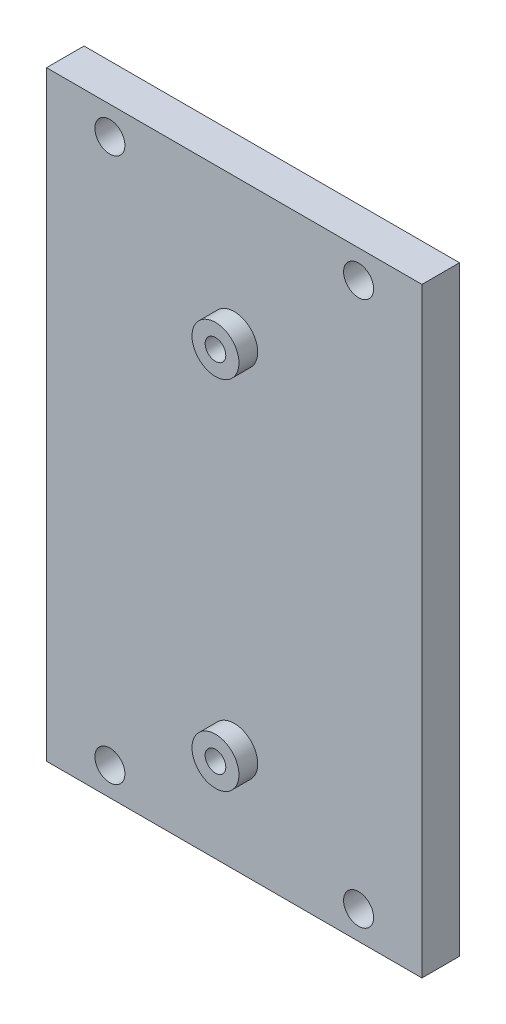
ISO-10303-21;
HEADER;
FILE_DESCRIPTION(('STEP AP214'),'2;1');
FILE_NAME('part.step','',(''),(''),'','','');
FILE_SCHEMA(('AUTOMOTIVE_DESIGN { 1 0 10303 214 1 1 1 1 }'));
ENDSEC;
DATA;
#1=APPLICATION_CONTEXT('core data for automotive mechanical design processes');
#2=APPLICATION_PROTOCOL_DEFINITION('international standard','automotive_design',2000,#1);
#3=PRODUCT_CONTEXT('',#1,'mechanical');
#4=PRODUCT('Part','Part','',(#3));
#5=PRODUCT_RELATED_PRODUCT_CATEGORY('part','',(#4));
#6=PRODUCT_DEFINITION_FORMATION('','',#4);
#7=PRODUCT_DEFINITION_CONTEXT('part definition',#1,'design');
#8=PRODUCT_DEFINITION('design','',#6,#7);
#9=PRODUCT_DEFINITION_SHAPE('','',#8);
#10=(LENGTH_UNIT() NAMED_UNIT(*) SI_UNIT(.MILLI.,.METRE.));
#11=(NAMED_UNIT(*) PLANE_ANGLE_UNIT() SI_UNIT($,.RADIAN.));
#12=(NAMED_UNIT(*) SI_UNIT($,.STERADIAN.) SOLID_ANGLE_UNIT());
#13=UNCERTAINTY_MEASURE_WITH_UNIT(LENGTH_MEASURE(1.E-05),#10,'distance_accuracy_value','');
#14=(GEOMETRIC_REPRESENTATION_CONTEXT(3) GLOBAL_UNCERTAINTY_ASSIGNED_CONTEXT((#13)) GLOBAL_UNIT_ASSIGNED_CONTEXT((#10,
#11,#12)) REPRESENTATION_CONTEXT('',''));
#15=CARTESIAN_POINT('',(0.,0.,0.));
#16=DIRECTION('',(0.,0.,1.));
#17=DIRECTION('',(1.,0.,0.));
#18=AXIS2_PLACEMENT_3D('',#15,#16,#17);
#19=CARTESIAN_POINT('',(0.,0.,4.));
#20=DIRECTION('',(0.,0.,-1.));
#21=DIRECTION('',(-1.,0.,0.));
#22=AXIS2_PLACEMENT_3D('',#19,#20,#21);
#23=PLANE('',#22);
#24=CARTESIAN_POINT('',(0.,-21.,4.));
#25=DIRECTION('',(0.,0.,-1.));
#26=DIRECTION('',(-1.,0.,0.));
#27=AXIS2_PLACEMENT_3D('',#24,#25,#26);
#28=CIRCLE('',#27,2.5);
#29=CARTESIAN_POINT('',(-2.5,-21.,4.));
#30=VERTEX_POINT('',#29);
#31=EDGE_CURVE('E55',#30,#30,#28,.F.);
#32=ORIENTED_EDGE('',*,*,#31,.F.);
#33=EDGE_LOOP('',(#32));
#34=FACE_BOUND('',#33,.T.);
#35=DIRECTION('',(0.,1.,0.));
#36=VECTOR('',#35,1.);
#37=CARTESIAN_POINT('',(20.,-32.,4.));
#38=LINE('',#37,#36);
#39=CARTESIAN_POINT('',(20.,-32.,4.));
#40=VERTEX_POINT('',#39);
#41=CARTESIAN_POINT('',(20.,32.,4.));
#42=VERTEX_POINT('',#41);
#43=EDGE_CURVE('E99',#40,#42,#38,.T.);
#44=ORIENTED_EDGE('',*,*,#43,.T.);
#45=DIRECTION('',(-1.,0.,0.));
#46=VECTOR('',#45,1.);
#47=CARTESIAN_POINT('',(-20.,32.,4.));
#48=LINE('',#47,#46);
#49=CARTESIAN_POINT('',(-20.,32.,4.));
#50=VERTEX_POINT('',#49);
#51=EDGE_CURVE('E94',#42,#50,#48,.T.);
#52=ORIENTED_EDGE('',*,*,#51,.T.);
#53=DIRECTION('',(0.,-1.,0.));
#54=VECTOR('',#53,1.);
#55=CARTESIAN_POINT('',(-20.,-32.,4.));
#56=LINE('',#55,#54);
#57=CARTESIAN_POINT('',(-20.,-32.,4.));
#58=VERTEX_POINT('',#57);
#59=EDGE_CURVE('E97',#50,#58,#56,.T.);
#60=ORIENTED_EDGE('',*,*,#59,.T.);
#61=DIRECTION('',(1.,0.,0.));
#62=VECTOR('',#61,1.);
#63=CARTESIAN_POINT('',(-20.,-32.,4.));
#64=LINE('',#63,#62);
#65=EDGE_CURVE('E63',#58,#40,#64,.T.);
#66=ORIENTED_EDGE('',*,*,#65,.T.);
#67=EDGE_LOOP('',(#44,#52,#60,#66));
#68=FACE_BOUND('',#67,.T.);
#69=CARTESIAN_POINT('',(-13.25,29.,4.));
#70=DIRECTION('',(0.,0.,1.));
#71=DIRECTION('',(1.,0.,0.));
#72=AXIS2_PLACEMENT_3D('',#69,#70,#71);
#73=CIRCLE('',#72,1.6);
#74=CARTESIAN_POINT('',(-11.65,29.,4.));
#75=VERTEX_POINT('',#74);
#76=EDGE_CURVE('E122',#75,#75,#73,.T.);
#77=ORIENTED_EDGE('',*,*,#76,.F.);
#78=EDGE_LOOP('',(#77));
#79=FACE_BOUND('',#78,.T.);
#80=CARTESIAN_POINT('',(13.25,29.,4.));
#81=DIRECTION('',(0.,0.,1.));
#82=DIRECTION('',(1.,0.,0.));
#83=AXIS2_PLACEMENT_3D('',#80,#81,#82);
#84=CIRCLE('',#83,1.6);
#85=CARTESIAN_POINT('',(14.85,29.,4.));
#86=VERTEX_POINT('',#85);
#87=EDGE_CURVE('E209',#86,#86,#84,.T.);
#88=ORIENTED_EDGE('',*,*,#87,.F.);
#89=EDGE_LOOP('',(#88));
#90=FACE_BOUND('',#89,.T.);
#91=CARTESIAN_POINT('',(-13.25,-29.,4.));
#92=DIRECTION('',(0.,0.,1.));
#93=DIRECTION('',(1.,0.,0.));
#94=AXIS2_PLACEMENT_3D('',#91,#92,#93);
#95=CIRCLE('',#94,1.6);
#96=CARTESIAN_POINT('',(-11.65,-29.,4.));
#97=VERTEX_POINT('',#96);
#98=EDGE_CURVE('E202',#97,#97,#95,.T.);
#99=ORIENTED_EDGE('',*,*,#98,.F.);
#100=EDGE_LOOP('',(#99));
#101=FACE_BOUND('',#100,.T.);
#102=CARTESIAN_POINT('',(13.25,-29.,4.));
#103=DIRECTION('',(0.,0.,1.));
#104=DIRECTION('',(1.,0.,0.));
#105=AXIS2_PLACEMENT_3D('',#102,#103,#104);
#106=CIRCLE('',#105,1.6);
#107=CARTESIAN_POINT('',(14.85,-29.,4.));
#108=VERTEX_POINT('',#107);
#109=EDGE_CURVE('E195',#108,#108,#106,.T.);
#110=ORIENTED_EDGE('',*,*,#109,.F.);
#111=EDGE_LOOP('',(#110));
#112=FACE_BOUND('',#111,.T.);
#113=CARTESIAN_POINT('',(0.,17.,4.));
#114=DIRECTION('',(0.,0.,-1.));
#115=DIRECTION('',(-1.,0.,0.));
#116=AXIS2_PLACEMENT_3D('',#113,#114,#115);
#117=CIRCLE('',#116,2.5);
#118=CARTESIAN_POINT('',(-2.5,17.,4.));
#119=VERTEX_POINT('',#118);
#120=EDGE_CURVE('E11',#119,#119,#117,.F.);
#121=ORIENTED_EDGE('',*,*,#120,.F.);
#122=EDGE_LOOP('',(#121));
#123=FACE_BOUND('',#122,.T.);
#124=ADVANCED_FACE('F45',(#34,#68,#79,#90,#101,#112,#123),#23,.F.);
#125=CARTESIAN_POINT('',(0.,0.,0.));
#126=DIRECTION('',(0.,0.,-1.));
#127=DIRECTION('',(-1.,0.,0.));
#128=AXIS2_PLACEMENT_3D('',#125,#126,#127);
#129=PLANE('',#128);
#130=CARTESIAN_POINT('',(0.,-21.,0.));
#131=DIRECTION('',(0.,0.,1.));
#132=DIRECTION('',(1.,0.,0.));
#133=AXIS2_PLACEMENT_3D('',#130,#131,#132);
#134=CIRCLE('',#133,1.1);
#135=CARTESIAN_POINT('',(1.1,-21.,0.));
#136=VERTEX_POINT('',#135);
#137=EDGE_CURVE('E181',#136,#136,#134,.T.);
#138=ORIENTED_EDGE('',*,*,#137,.T.);
#139=EDGE_LOOP('',(#138));
#140=FACE_BOUND('',#139,.T.);
#141=CARTESIAN_POINT('',(-13.25,-29.,0.));
#142=DIRECTION('',(0.,0.,1.));
#143=DIRECTION('',(1.,0.,0.));
#144=AXIS2_PLACEMENT_3D('',#141,#142,#143);
#145=CIRCLE('',#144,1.6);
#146=CARTESIAN_POINT('',(-11.65,-29.,0.));
#147=VERTEX_POINT('',#146);
#148=EDGE_CURVE('E199',#147,#147,#145,.T.);
#149=ORIENTED_EDGE('',*,*,#148,.T.);
#150=EDGE_LOOP('',(#149));
#151=FACE_BOUND('',#150,.T.);
#152=CARTESIAN_POINT('',(-13.25,29.,0.));
#153=DIRECTION('',(0.,0.,1.));
#154=DIRECTION('',(1.,0.,0.));
#155=AXIS2_PLACEMENT_3D('',#152,#153,#154);
#156=CIRCLE('',#155,1.6);
#157=CARTESIAN_POINT('',(-11.65,29.,0.));
#158=VERTEX_POINT('',#157);
#159=EDGE_CURVE('E213',#158,#158,#156,.T.);
#160=ORIENTED_EDGE('',*,*,#159,.T.);
#161=EDGE_LOOP('',(#160));
#162=FACE_BOUND('',#161,.T.);
#163=DIRECTION('',(0.,1.,0.));
#164=VECTOR('',#163,1.);
#165=CARTESIAN_POINT('',(20.,-32.,0.));
#166=LINE('',#165,#164);
#167=CARTESIAN_POINT('',(20.,-32.,0.));
#168=VERTEX_POINT('',#167);
#169=CARTESIAN_POINT('',(20.,32.,0.));
#170=VERTEX_POINT('',#169);
#171=EDGE_CURVE('E118',#168,#170,#166,.T.);
#172=ORIENTED_EDGE('',*,*,#171,.F.);
#173=DIRECTION('',(1.,0.,0.));
#174=VECTOR('',#173,1.);
#175=CARTESIAN_POINT('',(-20.,-32.,0.));
#176=LINE('',#175,#174);
#177=CARTESIAN_POINT('',(-20.,-32.,0.));
#178=VERTEX_POINT('',#177);
#179=EDGE_CURVE('E86',#178,#168,#176,.T.);
#180=ORIENTED_EDGE('',*,*,#179,.F.);
#181=DIRECTION('',(0.,-1.,0.));
#182=VECTOR('',#181,1.);
#183=CARTESIAN_POINT('',(-20.,-32.,0.));
#184=LINE('',#183,#182);
#185=CARTESIAN_POINT('',(-20.,32.,0.));
#186=VERTEX_POINT('',#185);
#187=EDGE_CURVE('E80',#186,#178,#184,.T.);
#188=ORIENTED_EDGE('',*,*,#187,.F.);
#189=DIRECTION('',(-1.,0.,0.));
#190=VECTOR('',#189,1.);
#191=CARTESIAN_POINT('',(-20.,32.,0.));
#192=LINE('',#191,#190);
#193=EDGE_CURVE('E105',#170,#186,#192,.T.);
#194=ORIENTED_EDGE('',*,*,#193,.F.);
#195=EDGE_LOOP('',(#172,#180,#188,#194));
#196=FACE_BOUND('',#195,.T.);
#197=CARTESIAN_POINT('',(13.25,29.,0.));
#198=DIRECTION('',(0.,0.,1.));
#199=DIRECTION('',(1.,0.,0.));
#200=AXIS2_PLACEMENT_3D('',#197,#198,#199);
#201=CIRCLE('',#200,1.6);
#202=CARTESIAN_POINT('',(14.85,29.,0.));
#203=VERTEX_POINT('',#202);
#204=EDGE_CURVE('E171',#203,#203,#201,.T.);
#205=ORIENTED_EDGE('',*,*,#204,.T.);
#206=EDGE_LOOP('',(#205));
#207=FACE_BOUND('',#206,.T.);
#208=CARTESIAN_POINT('',(13.25,-29.,0.));
#209=DIRECTION('',(0.,0.,1.));
#210=DIRECTION('',(1.,0.,0.));
#211=AXIS2_PLACEMENT_3D('',#208,#209,#210);
#212=CIRCLE('',#211,1.6);
#213=CARTESIAN_POINT('',(14.85,-29.,0.));
#214=VERTEX_POINT('',#213);
#215=EDGE_CURVE('E175',#214,#214,#212,.T.);
#216=ORIENTED_EDGE('',*,*,#215,.T.);
#217=EDGE_LOOP('',(#216));
#218=FACE_BOUND('',#217,.T.);
#219=CARTESIAN_POINT('',(0.,17.,0.));
#220=DIRECTION('',(0.,0.,1.));
#221=DIRECTION('',(1.,0.,0.));
#222=AXIS2_PLACEMENT_3D('',#219,#220,#221);
#223=CIRCLE('',#222,1.1);
#224=CARTESIAN_POINT('',(1.1,17.,0.));
#225=VERTEX_POINT('',#224);
#226=EDGE_CURVE('E178',#225,#225,#223,.T.);
#227=ORIENTED_EDGE('',*,*,#226,.T.);
#228=EDGE_LOOP('',(#227));
#229=FACE_BOUND('',#228,.T.);
#230=ADVANCED_FACE('F141',(#140,#151,#162,#196,#207,#218,#229),#129,.T.);
#231=CARTESIAN_POINT('',(20.,-32.,4.));
#232=DIRECTION('',(-1.,0.,0.));
#233=DIRECTION('',(0.,0.,1.));
#234=AXIS2_PLACEMENT_3D('',#231,#232,#233);
#235=PLANE('',#234);
#236=ORIENTED_EDGE('',*,*,#171,.T.);
#237=DIRECTION('',(0.,0.,-1.));
#238=VECTOR('',#237,1.);
#239=CARTESIAN_POINT('',(20.,32.,4.));
#240=LINE('',#239,#238);
#241=EDGE_CURVE('E107',#42,#170,#240,.T.);
#242=ORIENTED_EDGE('',*,*,#241,.F.);
#243=ORIENTED_EDGE('',*,*,#43,.F.);
#244=DIRECTION('',(0.,0.,-1.));
#245=VECTOR('',#244,1.);
#246=CARTESIAN_POINT('',(20.,-32.,4.));
#247=LINE('',#246,#245);
#248=EDGE_CURVE('E114',#40,#168,#247,.T.);
#249=ORIENTED_EDGE('',*,*,#248,.T.);
#250=EDGE_LOOP('',(#236,#242,#243,#249));
#251=FACE_BOUND('',#250,.T.);
#252=ADVANCED_FACE('F47',(#251),#235,.F.);
#253=CARTESIAN_POINT('',(-20.,32.,4.));
#254=DIRECTION('',(0.,-1.,0.));
#255=DIRECTION('',(0.,0.,-1.));
#256=AXIS2_PLACEMENT_3D('',#253,#254,#255);
#257=PLANE('',#256);
#258=ORIENTED_EDGE('',*,*,#193,.T.);
#259=DIRECTION('',(0.,0.,-1.));
#260=VECTOR('',#259,1.);
#261=CARTESIAN_POINT('',(-20.,32.,4.));
#262=LINE('',#261,#260);
#263=EDGE_CURVE('E103',#50,#186,#262,.T.);
#264=ORIENTED_EDGE('',*,*,#263,.F.);
#265=ORIENTED_EDGE('',*,*,#51,.F.);
#266=ORIENTED_EDGE('',*,*,#241,.T.);
#267=EDGE_LOOP('',(#258,#264,#265,#266));
#268=FACE_BOUND('',#267,.T.);
#269=ADVANCED_FACE('F104',(#268),#257,.F.);
#270=CARTESIAN_POINT('',(-20.,-32.,4.));
#271=DIRECTION('',(1.,0.,0.));
#272=DIRECTION('',(0.,0.,-1.));
#273=AXIS2_PLACEMENT_3D('',#270,#271,#272);
#274=PLANE('',#273);
#275=ORIENTED_EDGE('',*,*,#187,.T.);
#276=DIRECTION('',(0.,0.,-1.));
#277=VECTOR('',#276,1.);
#278=CARTESIAN_POINT('',(-20.,-32.,4.));
#279=LINE('',#278,#277);
#280=EDGE_CURVE('E108',#58,#178,#279,.T.);
#281=ORIENTED_EDGE('',*,*,#280,.F.);
#282=ORIENTED_EDGE('',*,*,#59,.F.);
#283=ORIENTED_EDGE('',*,*,#263,.T.);
#284=EDGE_LOOP('',(#275,#281,#282,#283));
#285=FACE_BOUND('',#284,.T.);
#286=ADVANCED_FACE('F110',(#285),#274,.F.);
#287=CARTESIAN_POINT('',(-20.,-32.,4.));
#288=DIRECTION('',(0.,1.,0.));
#289=DIRECTION('',(0.,0.,1.));
#290=AXIS2_PLACEMENT_3D('',#287,#288,#289);
#291=PLANE('',#290);
#292=ORIENTED_EDGE('',*,*,#179,.T.);
#293=ORIENTED_EDGE('',*,*,#248,.F.);
#294=ORIENTED_EDGE('',*,*,#65,.F.);
#295=ORIENTED_EDGE('',*,*,#280,.T.);
#296=EDGE_LOOP('',(#292,#293,#294,#295));
#297=FACE_BOUND('',#296,.T.);
#298=ADVANCED_FACE('F154',(#297),#291,.F.);
#299=CARTESIAN_POINT('',(-13.25,29.,4.));
#300=DIRECTION('',(0.,0.,-1.));
#301=DIRECTION('',(-1.,0.,0.));
#302=AXIS2_PLACEMENT_3D('',#299,#300,#301);
#303=CYLINDRICAL_SURFACE('',#302,1.6);
#304=ORIENTED_EDGE('',*,*,#76,.T.);
#305=EDGE_LOOP('',(#304));
#306=FACE_BOUND('',#305,.T.);
#307=ORIENTED_EDGE('',*,*,#159,.F.);
#308=EDGE_LOOP('',(#307));
#309=FACE_BOUND('',#308,.T.);
#310=ADVANCED_FACE('F151',(#306,#309),#303,.F.);
#311=CARTESIAN_POINT('',(13.25,29.,4.));
#312=DIRECTION('',(0.,0.,-1.));
#313=DIRECTION('',(-1.,0.,0.));
#314=AXIS2_PLACEMENT_3D('',#311,#312,#313);
#315=CYLINDRICAL_SURFACE('',#314,1.6);
#316=ORIENTED_EDGE('',*,*,#87,.T.);
#317=EDGE_LOOP('',(#316));
#318=FACE_BOUND('',#317,.T.);
#319=ORIENTED_EDGE('',*,*,#204,.F.);
#320=EDGE_LOOP('',(#319));
#321=FACE_BOUND('',#320,.T.);
#322=ADVANCED_FACE('F226',(#318,#321),#315,.F.);
#323=CARTESIAN_POINT('',(-13.25,-29.,4.));
#324=DIRECTION('',(0.,0.,-1.));
#325=DIRECTION('',(-1.,0.,0.));
#326=AXIS2_PLACEMENT_3D('',#323,#324,#325);
#327=CYLINDRICAL_SURFACE('',#326,1.6);
#328=ORIENTED_EDGE('',*,*,#98,.T.);
#329=EDGE_LOOP('',(#328));
#330=FACE_BOUND('',#329,.T.);
#331=ORIENTED_EDGE('',*,*,#148,.F.);
#332=EDGE_LOOP('',(#331));
#333=FACE_BOUND('',#332,.T.);
#334=ADVANCED_FACE('F231',(#330,#333),#327,.F.);
#335=CARTESIAN_POINT('',(13.25,-29.,4.));
#336=DIRECTION('',(0.,0.,-1.));
#337=DIRECTION('',(-1.,0.,0.));
#338=AXIS2_PLACEMENT_3D('',#335,#336,#337);
#339=CYLINDRICAL_SURFACE('',#338,1.6);
#340=ORIENTED_EDGE('',*,*,#109,.T.);
#341=EDGE_LOOP('',(#340));
#342=FACE_BOUND('',#341,.T.);
#343=ORIENTED_EDGE('',*,*,#215,.F.);
#344=EDGE_LOOP('',(#343));
#345=FACE_BOUND('',#344,.T.);
#346=ADVANCED_FACE('F267',(#342,#345),#339,.F.);
#347=CARTESIAN_POINT('',(0.,-21.,4.));
#348=DIRECTION('',(0.,0.,-1.));
#349=DIRECTION('',(-1.,0.,0.));
#350=AXIS2_PLACEMENT_3D('',#347,#348,#349);
#351=CYLINDRICAL_SURFACE('',#350,1.1);
#352=ORIENTED_EDGE('',*,*,#137,.F.);
#353=EDGE_LOOP('',(#352));
#354=FACE_BOUND('',#353,.T.);
#355=CARTESIAN_POINT('',(0.,-21.,6.));
#356=DIRECTION('',(0.,0.,1.));
#357=DIRECTION('',(1.,0.,0.));
#358=AXIS2_PLACEMENT_3D('',#355,#356,#357);
#359=CIRCLE('',#358,1.1);
#360=CARTESIAN_POINT('',(1.1,-21.,6.));
#361=VERTEX_POINT('',#360);
#362=EDGE_CURVE('E192',#361,#361,#359,.T.);
#363=ORIENTED_EDGE('',*,*,#362,.T.);
#364=EDGE_LOOP('',(#363));
#365=FACE_BOUND('',#364,.T.);
#366=ADVANCED_FACE('F265',(#354,#365),#351,.F.);
#367=CARTESIAN_POINT('',(0.,17.,4.));
#368=DIRECTION('',(0.,0.,-1.));
#369=DIRECTION('',(-1.,0.,0.));
#370=AXIS2_PLACEMENT_3D('',#367,#368,#369);
#371=CYLINDRICAL_SURFACE('',#370,1.1);
#372=ORIENTED_EDGE('',*,*,#226,.F.);
#373=EDGE_LOOP('',(#372));
#374=FACE_BOUND('',#373,.T.);
#375=CARTESIAN_POINT('',(0.,17.,6.));
#376=DIRECTION('',(0.,0.,1.));
#377=DIRECTION('',(1.,0.,0.));
#378=AXIS2_PLACEMENT_3D('',#375,#376,#377);
#379=CIRCLE('',#378,1.1);
#380=CARTESIAN_POINT('',(1.1,17.,6.));
#381=VERTEX_POINT('',#380);
#382=EDGE_CURVE('E189',#381,#381,#379,.T.);
#383=ORIENTED_EDGE('',*,*,#382,.T.);
#384=EDGE_LOOP('',(#383));
#385=FACE_BOUND('',#384,.T.);
#386=ADVANCED_FACE('F255',(#374,#385),#371,.F.);
#387=CARTESIAN_POINT('',(0.,17.,6.));
#388=DIRECTION('',(0.,0.,1.));
#389=DIRECTION('',(1.,0.,0.));
#390=AXIS2_PLACEMENT_3D('',#387,#388,#389);
#391=PLANE('',#390);
#392=CARTESIAN_POINT('',(0.,17.,6.));
#393=DIRECTION('',(0.,0.,1.));
#394=DIRECTION('',(1.,0.,0.));
#395=AXIS2_PLACEMENT_3D('',#392,#393,#394);
#396=CIRCLE('',#395,2.5);
#397=CARTESIAN_POINT('',(2.5,17.,6.));
#398=VERTEX_POINT('',#397);
#399=EDGE_CURVE('E182',#398,#398,#396,.T.);
#400=ORIENTED_EDGE('',*,*,#399,.T.);
#401=EDGE_LOOP('',(#400));
#402=FACE_BOUND('',#401,.T.);
#403=ORIENTED_EDGE('',*,*,#382,.F.);
#404=EDGE_LOOP('',(#403));
#405=FACE_BOUND('',#404,.T.);
#406=ADVANCED_FACE('F246',(#402,#405),#391,.T.);
#407=CARTESIAN_POINT('',(0.,17.,6.));
#408=DIRECTION('',(0.,0.,-1.));
#409=DIRECTION('',(-1.,0.,0.));
#410=AXIS2_PLACEMENT_3D('',#407,#408,#409);
#411=CYLINDRICAL_SURFACE('',#410,2.5);
#412=ORIENTED_EDGE('',*,*,#399,.F.);
#413=EDGE_LOOP('',(#412));
#414=FACE_BOUND('',#413,.T.);
#415=ORIENTED_EDGE('',*,*,#120,.T.);
#416=EDGE_LOOP('',(#415));
#417=FACE_BOUND('',#416,.T.);
#418=ADVANCED_FACE('F243',(#414,#417),#411,.T.);
#419=CARTESIAN_POINT('',(0.,-21.,6.));
#420=DIRECTION('',(0.,0.,1.));
#421=DIRECTION('',(1.,0.,0.));
#422=AXIS2_PLACEMENT_3D('',#419,#420,#421);
#423=PLANE('',#422);
#424=CARTESIAN_POINT('',(0.,-21.,6.));
#425=DIRECTION('',(0.,0.,1.));
#426=DIRECTION('',(1.,0.,0.));
#427=AXIS2_PLACEMENT_3D('',#424,#425,#426);
#428=CIRCLE('',#427,2.5);
#429=CARTESIAN_POINT('',(2.5,-21.,6.));
#430=VERTEX_POINT('',#429);
#431=EDGE_CURVE('E375',#430,#430,#428,.T.);
#432=ORIENTED_EDGE('',*,*,#431,.T.);
#433=EDGE_LOOP('',(#432));
#434=FACE_BOUND('',#433,.T.);
#435=ORIENTED_EDGE('',*,*,#362,.F.);
#436=EDGE_LOOP('',(#435));
#437=FACE_BOUND('',#436,.T.);
#438=ADVANCED_FACE('F245',(#434,#437),#423,.T.);
#439=CARTESIAN_POINT('',(0.,-21.,6.));
#440=DIRECTION('',(0.,0.,-1.));
#441=DIRECTION('',(-1.,0.,0.));
#442=AXIS2_PLACEMENT_3D('',#439,#440,#441);
#443=CYLINDRICAL_SURFACE('',#442,2.5);
#444=ORIENTED_EDGE('',*,*,#431,.F.);
#445=EDGE_LOOP('',(#444));
#446=FACE_BOUND('',#445,.T.);
#447=ORIENTED_EDGE('',*,*,#31,.T.);
#448=EDGE_LOOP('',(#447));
#449=FACE_BOUND('',#448,.T.);
#450=ADVANCED_FACE('F138',(#446,#449),#443,.T.);
#451=CLOSED_SHELL('',(#124,#230,#252,#269,#286,#298,#310,#322,#334,#346,#366,#386,#406,#418,
#438,#450));
#452=MANIFOLD_SOLID_BREP('B2',#451);
#453=ADVANCED_BREP_SHAPE_REPRESENTATION('',(#18,#452),#14);
#454=SHAPE_DEFINITION_REPRESENTATION(#9,#453);
ENDSEC;
END-ISO-10303-21;
